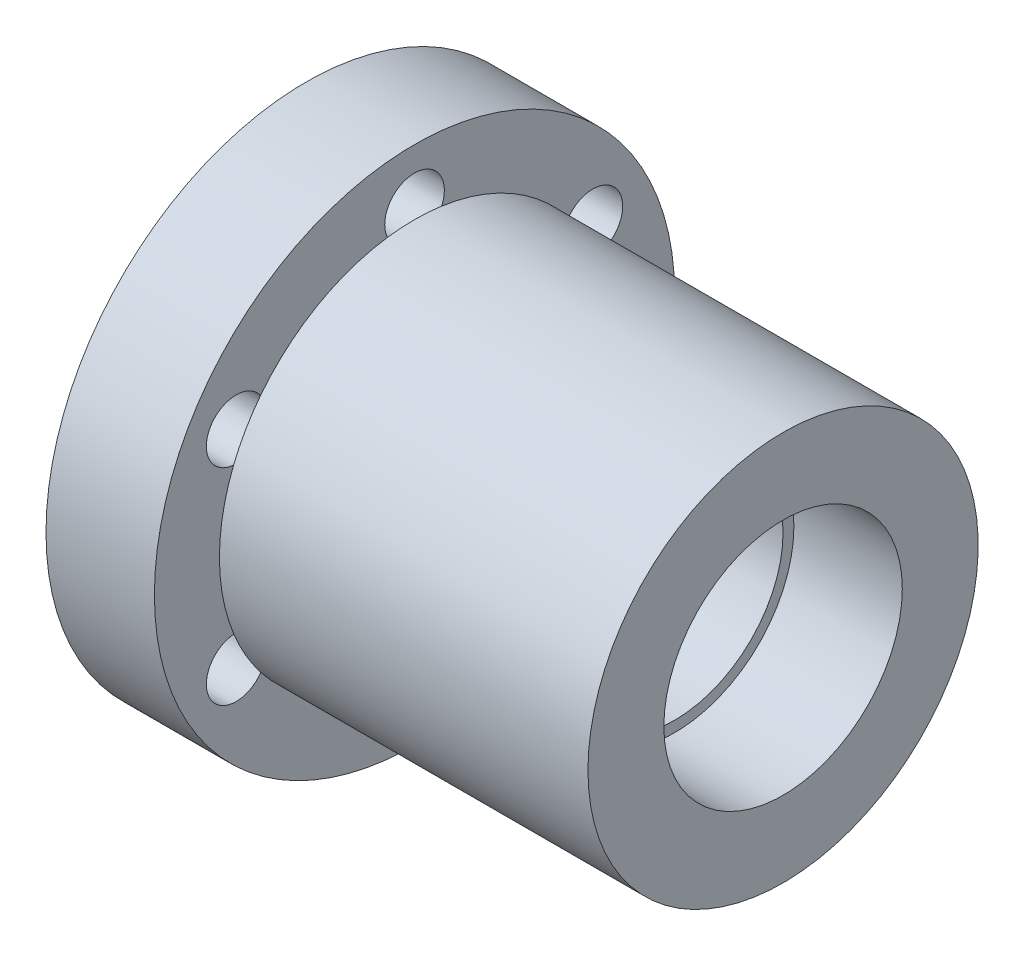
ISO-10303-21;
HEADER;
FILE_DESCRIPTION(('STEP AP214'),'2;1');
FILE_NAME('part.step','',(''),(''),'','','');
FILE_SCHEMA(('AUTOMOTIVE_DESIGN { 1 0 10303 214 1 1 1 1 }'));
ENDSEC;
DATA;
#1=APPLICATION_CONTEXT('core data for automotive mechanical design processes');
#2=APPLICATION_PROTOCOL_DEFINITION('international standard','automotive_design',2000,#1);
#3=PRODUCT_CONTEXT('',#1,'mechanical');
#4=PRODUCT('Part','Part','',(#3));
#5=PRODUCT_RELATED_PRODUCT_CATEGORY('part','',(#4));
#6=PRODUCT_DEFINITION_FORMATION('','',#4);
#7=PRODUCT_DEFINITION_CONTEXT('part definition',#1,'design');
#8=PRODUCT_DEFINITION('design','',#6,#7);
#9=PRODUCT_DEFINITION_SHAPE('','',#8);
#10=(LENGTH_UNIT() NAMED_UNIT(*) SI_UNIT(.MILLI.,.METRE.));
#11=(NAMED_UNIT(*) PLANE_ANGLE_UNIT() SI_UNIT($,.RADIAN.));
#12=(NAMED_UNIT(*) SI_UNIT($,.STERADIAN.) SOLID_ANGLE_UNIT());
#13=UNCERTAINTY_MEASURE_WITH_UNIT(LENGTH_MEASURE(1.E-05),#10,'distance_accuracy_value','');
#14=(GEOMETRIC_REPRESENTATION_CONTEXT(3) GLOBAL_UNCERTAINTY_ASSIGNED_CONTEXT((#13)) GLOBAL_UNIT_ASSIGNED_CONTEXT((#10,
#11,#12)) REPRESENTATION_CONTEXT('',''));
#15=CARTESIAN_POINT('',(0.,0.,0.));
#16=DIRECTION('',(0.,0.,1.));
#17=DIRECTION('',(1.,0.,0.));
#18=AXIS2_PLACEMENT_3D('',#15,#16,#17);
#19=CARTESIAN_POINT('',(0.,24.,0.));
#20=DIRECTION('',(-1.,0.,0.));
#21=DIRECTION('',(0.,0.,1.));
#22=AXIS2_PLACEMENT_3D('',#19,#20,#21);
#23=CYLINDRICAL_SURFACE('',#22,24.);
#24=CARTESIAN_POINT('',(9.99999999999999,24.,0.));
#25=DIRECTION('',(-1.,0.,0.));
#26=DIRECTION('',(0.,0.,1.));
#27=AXIS2_PLACEMENT_3D('',#24,#25,#26);
#28=CIRCLE('',#27,24.);
#29=CARTESIAN_POINT('',(9.99999999999999,24.,24.));
#30=VERTEX_POINT('',#29);
#31=EDGE_CURVE('E11',#30,#30,#28,.T.);
#32=ORIENTED_EDGE('',*,*,#31,.T.);
#33=EDGE_LOOP('',(#32));
#34=FACE_BOUND('',#33,.T.);
#35=CARTESIAN_POINT('',(0.,24.,0.));
#36=DIRECTION('',(-1.,0.,0.));
#37=DIRECTION('',(0.,0.,1.));
#38=AXIS2_PLACEMENT_3D('',#35,#36,#37);
#39=CIRCLE('',#38,24.);
#40=CARTESIAN_POINT('',(0.,24.,24.));
#41=VERTEX_POINT('',#40);
#42=EDGE_CURVE('E139',#41,#41,#39,.T.);
#43=ORIENTED_EDGE('',*,*,#42,.F.);
#44=EDGE_LOOP('',(#43));
#45=FACE_BOUND('',#44,.T.);
#46=ADVANCED_FACE('F37',(#34,#45),#23,.T.);
#47=CARTESIAN_POINT('',(9.99999999999999,0.,0.));
#48=DIRECTION('',(1.,0.,0.));
#49=DIRECTION('',(0.,0.,-1.));
#50=AXIS2_PLACEMENT_3D('',#47,#48,#49);
#51=PLANE('',#50);
#52=CARTESIAN_POINT('',(10.,42.9719667688482,0.));
#53=DIRECTION('',(-1.,0.,0.));
#54=DIRECTION('',(0.,0.,1.));
#55=AXIS2_PLACEMENT_3D('',#52,#53,#54);
#56=CIRCLE('',#55,2.75);
#57=CARTESIAN_POINT('',(9.99999999999999,41.8255905494437,2.49966429017656));
#58=VERTEX_POINT('',#57);
#59=CARTESIAN_POINT('',(10.,41.8255905494437,-2.49966429017656));
#60=VERTEX_POINT('',#59);
#61=EDGE_CURVE('E171',#58,#60,#56,.T.);
#62=ORIENTED_EDGE('',*,*,#61,.T.);
#63=CARTESIAN_POINT('',(9.99999999999999,24.,0.));
#64=DIRECTION('',(-1.,0.,0.));
#65=DIRECTION('',(0.,0.,1.));
#66=AXIS2_PLACEMENT_3D('',#63,#64,#65);
#67=CIRCLE('',#66,18.);
#68=CARTESIAN_POINT('',(9.99999999999999,35.0545675738859,-14.2055107530279));
#69=VERTEX_POINT('',#68);
#70=EDGE_CURVE('E116',#60,#69,#67,.T.);
#71=ORIENTED_EDGE('',*,*,#70,.T.);
#72=CARTESIAN_POINT('',(10.,33.4719667688477,-16.4544826719038));
#73=DIRECTION('',(-1.,0.,0.));
#74=DIRECTION('',(0.,0.,1.));
#75=AXIS2_PLACEMENT_3D('',#72,#73,#74);
#76=CIRCLE('',#75,2.75);
#77=CARTESIAN_POINT('',(10.,30.7323791654478,-16.6935637529152));
#78=VERTEX_POINT('',#77);
#79=EDGE_CURVE('E147',#69,#78,#76,.T.);
#80=ORIENTED_EDGE('',*,*,#79,.T.);
#81=CARTESIAN_POINT('',(9.99999999999999,17.2133834491785,-16.6715876806055));
#82=VERTEX_POINT('',#81);
#83=EDGE_CURVE('E180',#78,#82,#67,.T.);
#84=ORIENTED_EDGE('',*,*,#83,.T.);
#85=CARTESIAN_POINT('',(10.,14.4719667688476,-16.4544826719032));
#86=DIRECTION('',(-1.,0.,0.));
#87=DIRECTION('',(0.,0.,1.));
#88=AXIS2_PLACEMENT_3D('',#85,#86,#87);
#89=CIRCLE('',#88,2.75);
#90=CARTESIAN_POINT('',(10.,12.9190305378434,-14.184925652916));
#91=VERTEX_POINT('',#90);
#92=EDGE_CURVE('E148',#82,#91,#89,.T.);
#93=ORIENTED_EDGE('',*,*,#92,.T.);
#94=CARTESIAN_POINT('',(9.99999999999999,6.17094903074348,-2.47486192254298));
#95=VERTEX_POINT('',#94);
#96=EDGE_CURVE('E186',#91,#95,#67,.T.);
#97=ORIENTED_EDGE('',*,*,#96,.T.);
#98=CARTESIAN_POINT('',(10.,4.97196676884817,1.47727936570424E-12));
#99=DIRECTION('',(-1.,0.,0.));
#100=DIRECTION('',(0.,0.,1.));
#101=AXIS2_PLACEMENT_3D('',#98,#99,#100);
#102=CIRCLE('',#101,2.75);
#103=CARTESIAN_POINT('',(10.,6.17094903074386,2.47486192254574));
#104=VERTEX_POINT('',#103);
#105=EDGE_CURVE('E154',#95,#104,#102,.T.);
#106=ORIENTED_EDGE('',*,*,#105,.T.);
#107=CARTESIAN_POINT('',(9.99999999999999,12.9190305378455,14.1849256529176));
#108=VERTEX_POINT('',#107);
#109=EDGE_CURVE('E195',#104,#108,#67,.T.);
#110=ORIENTED_EDGE('',*,*,#109,.T.);
#111=CARTESIAN_POINT('',(10.,14.4719667688488,16.4544826719055));
#112=DIRECTION('',(-1.,0.,0.));
#113=DIRECTION('',(0.,0.,1.));
#114=AXIS2_PLACEMENT_3D('',#111,#112,#113);
#115=CIRCLE('',#114,2.75);
#116=CARTESIAN_POINT('',(10.,17.2133834491798,16.671587680606));
#117=VERTEX_POINT('',#116);
#118=EDGE_CURVE('E159',#108,#117,#115,.T.);
#119=ORIENTED_EDGE('',*,*,#118,.T.);
#120=CARTESIAN_POINT('',(9.99999999999999,30.7323791654488,16.6935637529148));
#121=VERTEX_POINT('',#120);
#122=EDGE_CURVE('E96',#117,#121,#67,.T.);
#123=ORIENTED_EDGE('',*,*,#122,.T.);
#124=CARTESIAN_POINT('',(10.,33.4719667688488,16.4544826719048));
#125=DIRECTION('',(-1.,0.,0.));
#126=DIRECTION('',(0.,0.,1.));
#127=AXIS2_PLACEMENT_3D('',#124,#125,#126);
#128=CIRCLE('',#127,2.75);
#129=CARTESIAN_POINT('',(10.,35.0545675738858,14.205510753028));
#130=VERTEX_POINT('',#129);
#131=EDGE_CURVE('E101',#121,#130,#128,.T.);
#132=ORIENTED_EDGE('',*,*,#131,.T.);
#133=EDGE_CURVE('E95',#130,#58,#67,.T.);
#134=ORIENTED_EDGE('',*,*,#133,.T.);
#135=EDGE_LOOP('',(#62,#71,#80,#84,#93,#97,#106,#110,#119,#123,#132,#134));
#136=FACE_BOUND('',#135,.T.);
#137=ORIENTED_EDGE('',*,*,#31,.F.);
#138=EDGE_LOOP('',(#137));
#139=FACE_BOUND('',#138,.T.);
#140=ADVANCED_FACE('F108',(#136,#139),#51,.T.);
#141=CARTESIAN_POINT('',(0.,24.,0.));
#142=DIRECTION('',(-1.,0.,0.));
#143=DIRECTION('',(0.,0.,1.));
#144=AXIS2_PLACEMENT_3D('',#141,#142,#143);
#145=CYLINDRICAL_SURFACE('',#144,18.);
#146=CARTESIAN_POINT('',(44.,24.,0.));
#147=DIRECTION('',(-1.,0.,0.));
#148=DIRECTION('',(0.,0.,1.));
#149=AXIS2_PLACEMENT_3D('',#146,#147,#148);
#150=CIRCLE('',#149,18.);
#151=CARTESIAN_POINT('',(44.,24.,18.));
#152=VERTEX_POINT('',#151);
#153=EDGE_CURVE('E118',#152,#152,#150,.T.);
#154=ORIENTED_EDGE('',*,*,#153,.T.);
#155=EDGE_LOOP('',(#154));
#156=FACE_BOUND('',#155,.T.);
#157=EDGE_CURVE('E44',#121,#130,#67,.T.);
#158=ORIENTED_EDGE('',*,*,#157,.F.);
#159=ORIENTED_EDGE('',*,*,#122,.F.);
#160=EDGE_CURVE('E198',#108,#117,#67,.T.);
#161=ORIENTED_EDGE('',*,*,#160,.F.);
#162=ORIENTED_EDGE('',*,*,#109,.F.);
#163=EDGE_CURVE('E192',#95,#104,#67,.T.);
#164=ORIENTED_EDGE('',*,*,#163,.F.);
#165=ORIENTED_EDGE('',*,*,#96,.F.);
#166=EDGE_CURVE('E185',#82,#91,#67,.T.);
#167=ORIENTED_EDGE('',*,*,#166,.F.);
#168=ORIENTED_EDGE('',*,*,#83,.F.);
#169=EDGE_CURVE('E179',#69,#78,#67,.T.);
#170=ORIENTED_EDGE('',*,*,#169,.F.);
#171=ORIENTED_EDGE('',*,*,#70,.F.);
#172=EDGE_CURVE('E115',#58,#60,#67,.T.);
#173=ORIENTED_EDGE('',*,*,#172,.F.);
#174=ORIENTED_EDGE('',*,*,#133,.F.);
#175=EDGE_LOOP('',(#158,#159,#161,#162,#164,#165,#167,#168,#170,#171,#173,#174));
#176=FACE_BOUND('',#175,.T.);
#177=ADVANCED_FACE('F113',(#156,#176),#145,.T.);
#178=CARTESIAN_POINT('',(44.,6.,0.));
#179=DIRECTION('',(1.,0.,0.));
#180=DIRECTION('',(0.,0.,-1.));
#181=AXIS2_PLACEMENT_3D('',#178,#179,#180);
#182=PLANE('',#181);
#183=CARTESIAN_POINT('',(44.,24.,0.));
#184=DIRECTION('',(-1.,0.,0.));
#185=DIRECTION('',(0.,0.,1.));
#186=AXIS2_PLACEMENT_3D('',#183,#184,#185);
#187=CIRCLE('',#186,11.);
#188=CARTESIAN_POINT('',(44.,24.,11.));
#189=VERTEX_POINT('',#188);
#190=EDGE_CURVE('E121',#189,#189,#187,.T.);
#191=ORIENTED_EDGE('',*,*,#190,.T.);
#192=EDGE_LOOP('',(#191));
#193=FACE_BOUND('',#192,.T.);
#194=ORIENTED_EDGE('',*,*,#153,.F.);
#195=EDGE_LOOP('',(#194));
#196=FACE_BOUND('',#195,.T.);
#197=ADVANCED_FACE('F247',(#193,#196),#182,.T.);
#198=CARTESIAN_POINT('',(0.,24.,0.));
#199=DIRECTION('',(-1.,0.,0.));
#200=DIRECTION('',(0.,0.,1.));
#201=AXIS2_PLACEMENT_3D('',#198,#199,#200);
#202=CYLINDRICAL_SURFACE('',#201,11.);
#203=CARTESIAN_POINT('',(34.,24.,0.));
#204=DIRECTION('',(-1.,0.,0.));
#205=DIRECTION('',(0.,0.,1.));
#206=AXIS2_PLACEMENT_3D('',#203,#204,#205);
#207=CIRCLE('',#206,11.);
#208=CARTESIAN_POINT('',(34.,24.,11.));
#209=VERTEX_POINT('',#208);
#210=EDGE_CURVE('E124',#209,#209,#207,.T.);
#211=ORIENTED_EDGE('',*,*,#210,.T.);
#212=EDGE_LOOP('',(#211));
#213=FACE_BOUND('',#212,.T.);
#214=ORIENTED_EDGE('',*,*,#190,.F.);
#215=EDGE_LOOP('',(#214));
#216=FACE_BOUND('',#215,.T.);
#217=ADVANCED_FACE('F241',(#213,#216),#202,.F.);
#218=CARTESIAN_POINT('',(34.,13.,0.));
#219=DIRECTION('',(1.,0.,0.));
#220=DIRECTION('',(0.,0.,-1.));
#221=AXIS2_PLACEMENT_3D('',#218,#219,#220);
#222=PLANE('',#221);
#223=CARTESIAN_POINT('',(34.,24.,0.));
#224=DIRECTION('',(-1.,0.,0.));
#225=DIRECTION('',(0.,0.,1.));
#226=AXIS2_PLACEMENT_3D('',#223,#224,#225);
#227=CIRCLE('',#226,10.);
#228=CARTESIAN_POINT('',(34.,24.,10.));
#229=VERTEX_POINT('',#228);
#230=EDGE_CURVE('E127',#229,#229,#227,.T.);
#231=ORIENTED_EDGE('',*,*,#230,.T.);
#232=EDGE_LOOP('',(#231));
#233=FACE_BOUND('',#232,.T.);
#234=ORIENTED_EDGE('',*,*,#210,.F.);
#235=EDGE_LOOP('',(#234));
#236=FACE_BOUND('',#235,.T.);
#237=ADVANCED_FACE('F235',(#233,#236),#222,.T.);
#238=CARTESIAN_POINT('',(0.,24.,0.));
#239=DIRECTION('',(-1.,0.,0.));
#240=DIRECTION('',(0.,0.,1.));
#241=AXIS2_PLACEMENT_3D('',#238,#239,#240);
#242=CYLINDRICAL_SURFACE('',#241,10.);
#243=CARTESIAN_POINT('',(10.,24.,0.));
#244=DIRECTION('',(-1.,0.,0.));
#245=DIRECTION('',(0.,0.,1.));
#246=AXIS2_PLACEMENT_3D('',#243,#244,#245);
#247=CIRCLE('',#246,10.);
#248=CARTESIAN_POINT('',(10.,24.,10.));
#249=VERTEX_POINT('',#248);
#250=EDGE_CURVE('E130',#249,#249,#247,.T.);
#251=ORIENTED_EDGE('',*,*,#250,.T.);
#252=EDGE_LOOP('',(#251));
#253=FACE_BOUND('',#252,.T.);
#254=ORIENTED_EDGE('',*,*,#230,.F.);
#255=EDGE_LOOP('',(#254));
#256=FACE_BOUND('',#255,.T.);
#257=ADVANCED_FACE('F229',(#253,#256),#242,.F.);
#258=CARTESIAN_POINT('',(10.,14.,0.));
#259=DIRECTION('',(-1.,0.,0.));
#260=DIRECTION('',(0.,0.,1.));
#261=AXIS2_PLACEMENT_3D('',#258,#259,#260);
#262=PLANE('',#261);
#263=CARTESIAN_POINT('',(10.,24.,0.));
#264=DIRECTION('',(-1.,0.,0.));
#265=DIRECTION('',(0.,0.,1.));
#266=AXIS2_PLACEMENT_3D('',#263,#264,#265);
#267=CIRCLE('',#266,11.);
#268=CARTESIAN_POINT('',(10.,24.,11.));
#269=VERTEX_POINT('',#268);
#270=EDGE_CURVE('E133',#269,#269,#267,.T.);
#271=ORIENTED_EDGE('',*,*,#270,.T.);
#272=EDGE_LOOP('',(#271));
#273=FACE_BOUND('',#272,.T.);
#274=ORIENTED_EDGE('',*,*,#250,.F.);
#275=EDGE_LOOP('',(#274));
#276=FACE_BOUND('',#275,.T.);
#277=ADVANCED_FACE('F223',(#273,#276),#262,.T.);
#278=CARTESIAN_POINT('',(0.,24.,0.));
#279=DIRECTION('',(-1.,0.,0.));
#280=DIRECTION('',(0.,0.,1.));
#281=AXIS2_PLACEMENT_3D('',#278,#279,#280);
#282=CYLINDRICAL_SURFACE('',#281,11.);
#283=CARTESIAN_POINT('',(0.,24.,0.));
#284=DIRECTION('',(-1.,0.,0.));
#285=DIRECTION('',(0.,0.,1.));
#286=AXIS2_PLACEMENT_3D('',#283,#284,#285);
#287=CIRCLE('',#286,11.);
#288=CARTESIAN_POINT('',(0.,24.,11.));
#289=VERTEX_POINT('',#288);
#290=EDGE_CURVE('E136',#289,#289,#287,.T.);
#291=ORIENTED_EDGE('',*,*,#290,.T.);
#292=EDGE_LOOP('',(#291));
#293=FACE_BOUND('',#292,.T.);
#294=ORIENTED_EDGE('',*,*,#270,.F.);
#295=EDGE_LOOP('',(#294));
#296=FACE_BOUND('',#295,.T.);
#297=ADVANCED_FACE('F212',(#293,#296),#282,.F.);
#298=CARTESIAN_POINT('',(0.,13.,0.));
#299=DIRECTION('',(-1.,0.,0.));
#300=DIRECTION('',(0.,0.,1.));
#301=AXIS2_PLACEMENT_3D('',#298,#299,#300);
#302=PLANE('',#301);
#303=CARTESIAN_POINT('',(0.,42.9719667688482,0.));
#304=DIRECTION('',(-1.,0.,0.));
#305=DIRECTION('',(0.,0.,1.));
#306=AXIS2_PLACEMENT_3D('',#303,#304,#305);
#307=CIRCLE('',#306,2.75);
#308=CARTESIAN_POINT('',(0.,42.9719667688482,2.75));
#309=VERTEX_POINT('',#308);
#310=EDGE_CURVE('E103',#309,#309,#307,.T.);
#311=ORIENTED_EDGE('',*,*,#310,.F.);
#312=EDGE_LOOP('',(#311));
#313=FACE_BOUND('',#312,.T.);
#314=CARTESIAN_POINT('',(0.,33.4719667688477,-16.4544826719038));
#315=DIRECTION('',(-1.,0.,0.));
#316=DIRECTION('',(0.,0.,1.));
#317=AXIS2_PLACEMENT_3D('',#314,#315,#316);
#318=CIRCLE('',#317,2.75);
#319=CARTESIAN_POINT('',(0.,33.4719667688477,-13.7044826719038));
#320=VERTEX_POINT('',#319);
#321=EDGE_CURVE('E163',#320,#320,#318,.T.);
#322=ORIENTED_EDGE('',*,*,#321,.F.);
#323=EDGE_LOOP('',(#322));
#324=FACE_BOUND('',#323,.T.);
#325=CARTESIAN_POINT('',(0.,14.4719667688476,-16.4544826719032));
#326=DIRECTION('',(-1.,0.,0.));
#327=DIRECTION('',(0.,0.,1.));
#328=AXIS2_PLACEMENT_3D('',#325,#326,#327);
#329=CIRCLE('',#328,2.75);
#330=CARTESIAN_POINT('',(0.,14.4719667688476,-13.7044826719032));
#331=VERTEX_POINT('',#330);
#332=EDGE_CURVE('E143',#331,#331,#329,.T.);
#333=ORIENTED_EDGE('',*,*,#332,.F.);
#334=EDGE_LOOP('',(#333));
#335=FACE_BOUND('',#334,.T.);
#336=CARTESIAN_POINT('',(0.,4.97196676884817,1.47727936570424E-12));
#337=DIRECTION('',(-1.,0.,0.));
#338=DIRECTION('',(0.,0.,1.));
#339=AXIS2_PLACEMENT_3D('',#336,#337,#338);
#340=CIRCLE('',#339,2.75);
#341=CARTESIAN_POINT('',(0.,4.97196676884817,2.75000000000148));
#342=VERTEX_POINT('',#341);
#343=EDGE_CURVE('E151',#342,#342,#340,.T.);
#344=ORIENTED_EDGE('',*,*,#343,.F.);
#345=EDGE_LOOP('',(#344));
#346=FACE_BOUND('',#345,.T.);
#347=CARTESIAN_POINT('',(0.,14.4719667688488,16.4544826719055));
#348=DIRECTION('',(-1.,0.,0.));
#349=DIRECTION('',(0.,0.,1.));
#350=AXIS2_PLACEMENT_3D('',#347,#348,#349);
#351=CIRCLE('',#350,2.75);
#352=CARTESIAN_POINT('',(0.,14.4719667688488,19.2044826719055));
#353=VERTEX_POINT('',#352);
#354=EDGE_CURVE('E156',#353,#353,#351,.T.);
#355=ORIENTED_EDGE('',*,*,#354,.F.);
#356=EDGE_LOOP('',(#355));
#357=FACE_BOUND('',#356,.T.);
#358=CARTESIAN_POINT('',(0.,33.4719667688488,16.4544826719048));
#359=DIRECTION('',(-1.,0.,0.));
#360=DIRECTION('',(0.,0.,1.));
#361=AXIS2_PLACEMENT_3D('',#358,#359,#360);
#362=CIRCLE('',#361,2.75);
#363=CARTESIAN_POINT('',(0.,33.4719667688488,19.2044826719048));
#364=VERTEX_POINT('',#363);
#365=EDGE_CURVE('E111',#364,#364,#362,.T.);
#366=ORIENTED_EDGE('',*,*,#365,.F.);
#367=EDGE_LOOP('',(#366));
#368=FACE_BOUND('',#367,.T.);
#369=ORIENTED_EDGE('',*,*,#42,.T.);
#370=EDGE_LOOP('',(#369));
#371=FACE_BOUND('',#370,.T.);
#372=ORIENTED_EDGE('',*,*,#290,.F.);
#373=EDGE_LOOP('',(#372));
#374=FACE_BOUND('',#373,.T.);
#375=ADVANCED_FACE('F209',(#313,#324,#335,#346,#357,#368,#371,#374),#302,.T.);
#376=CARTESIAN_POINT('',(10.,33.4719667688488,16.4544826719048));
#377=DIRECTION('',(-1.,0.,0.));
#378=DIRECTION('',(0.,0.,1.));
#379=AXIS2_PLACEMENT_3D('',#376,#377,#378);
#380=CYLINDRICAL_SURFACE('',#379,2.75);
#381=EDGE_CURVE('E90',#130,#121,#128,.T.);
#382=ORIENTED_EDGE('',*,*,#381,.F.);
#383=ORIENTED_EDGE('',*,*,#131,.F.);
#384=EDGE_LOOP('',(#382,#383));
#385=FACE_BOUND('',#384,.T.);
#386=ORIENTED_EDGE('',*,*,#365,.T.);
#387=EDGE_LOOP('',(#386));
#388=FACE_BOUND('',#387,.T.);
#389=ADVANCED_FACE('F99',(#385,#388),#380,.F.);
#390=CARTESIAN_POINT('',(10.,33.4719667688488,16.4544826719048));
#391=DIRECTION('',(-1.,0.,0.));
#392=DIRECTION('',(0.,0.,1.));
#393=AXIS2_PLACEMENT_3D('',#390,#391,#392);
#394=PLANE('',#393);
#395=ORIENTED_EDGE('',*,*,#381,.T.);
#396=ORIENTED_EDGE('',*,*,#157,.T.);
#397=EDGE_LOOP('',(#395,#396));
#398=FACE_BOUND('',#397,.T.);
#399=ADVANCED_FACE('F89',(#398),#394,.T.);
#400=CARTESIAN_POINT('',(10.,14.4719667688488,16.4544826719055));
#401=DIRECTION('',(-1.,0.,0.));
#402=DIRECTION('',(0.,0.,1.));
#403=AXIS2_PLACEMENT_3D('',#400,#401,#402);
#404=CYLINDRICAL_SURFACE('',#403,2.75);
#405=EDGE_CURVE('E50',#117,#108,#115,.T.);
#406=ORIENTED_EDGE('',*,*,#405,.F.);
#407=ORIENTED_EDGE('',*,*,#118,.F.);
#408=EDGE_LOOP('',(#406,#407));
#409=FACE_BOUND('',#408,.T.);
#410=ORIENTED_EDGE('',*,*,#354,.T.);
#411=EDGE_LOOP('',(#410));
#412=FACE_BOUND('',#411,.T.);
#413=ADVANCED_FACE('F203',(#409,#412),#404,.F.);
#414=CARTESIAN_POINT('',(10.,14.4719667688488,16.4544826719055));
#415=DIRECTION('',(-1.,0.,0.));
#416=DIRECTION('',(0.,0.,1.));
#417=AXIS2_PLACEMENT_3D('',#414,#415,#416);
#418=PLANE('',#417);
#419=ORIENTED_EDGE('',*,*,#405,.T.);
#420=ORIENTED_EDGE('',*,*,#160,.T.);
#421=EDGE_LOOP('',(#419,#420));
#422=FACE_BOUND('',#421,.T.);
#423=ADVANCED_FACE('F201',(#422),#418,.T.);
#424=CARTESIAN_POINT('',(10.,4.97196676884817,1.47727936570424E-12));
#425=DIRECTION('',(-1.,0.,0.));
#426=DIRECTION('',(0.,0.,1.));
#427=AXIS2_PLACEMENT_3D('',#424,#425,#426);
#428=CYLINDRICAL_SURFACE('',#427,2.75);
#429=EDGE_CURVE('E57',#104,#95,#102,.T.);
#430=ORIENTED_EDGE('',*,*,#429,.F.);
#431=ORIENTED_EDGE('',*,*,#105,.F.);
#432=EDGE_LOOP('',(#430,#431));
#433=FACE_BOUND('',#432,.T.);
#434=ORIENTED_EDGE('',*,*,#343,.T.);
#435=EDGE_LOOP('',(#434));
#436=FACE_BOUND('',#435,.T.);
#437=ADVANCED_FACE('F318',(#433,#436),#428,.F.);
#438=CARTESIAN_POINT('',(10.,4.97196676884817,1.47727936570424E-12));
#439=DIRECTION('',(-1.,0.,0.));
#440=DIRECTION('',(0.,0.,1.));
#441=AXIS2_PLACEMENT_3D('',#438,#439,#440);
#442=PLANE('',#441);
#443=ORIENTED_EDGE('',*,*,#429,.T.);
#444=ORIENTED_EDGE('',*,*,#163,.T.);
#445=EDGE_LOOP('',(#443,#444));
#446=FACE_BOUND('',#445,.T.);
#447=ADVANCED_FACE('F327',(#446),#442,.T.);
#448=CARTESIAN_POINT('',(10.,14.4719667688476,-16.4544826719032));
#449=DIRECTION('',(-1.,0.,0.));
#450=DIRECTION('',(0.,0.,1.));
#451=AXIS2_PLACEMENT_3D('',#448,#449,#450);
#452=CYLINDRICAL_SURFACE('',#451,2.75);
#453=ORIENTED_EDGE('',*,*,#92,.F.);
#454=EDGE_CURVE('E146',#91,#82,#89,.T.);
#455=ORIENTED_EDGE('',*,*,#454,.F.);
#456=EDGE_LOOP('',(#453,#455));
#457=FACE_BOUND('',#456,.T.);
#458=ORIENTED_EDGE('',*,*,#332,.T.);
#459=EDGE_LOOP('',(#458));
#460=FACE_BOUND('',#459,.T.);
#461=ADVANCED_FACE('F337',(#457,#460),#452,.F.);
#462=CARTESIAN_POINT('',(10.,14.4719667688476,-16.4544826719032));
#463=DIRECTION('',(-1.,0.,0.));
#464=DIRECTION('',(0.,0.,1.));
#465=AXIS2_PLACEMENT_3D('',#462,#463,#464);
#466=PLANE('',#465);
#467=ORIENTED_EDGE('',*,*,#454,.T.);
#468=ORIENTED_EDGE('',*,*,#166,.T.);
#469=EDGE_LOOP('',(#467,#468));
#470=FACE_BOUND('',#469,.T.);
#471=ADVANCED_FACE('F346',(#470),#466,.T.);
#472=CARTESIAN_POINT('',(10.,33.4719667688477,-16.4544826719038));
#473=DIRECTION('',(-1.,0.,0.));
#474=DIRECTION('',(0.,0.,1.));
#475=AXIS2_PLACEMENT_3D('',#472,#473,#474);
#476=CYLINDRICAL_SURFACE('',#475,2.75);
#477=ORIENTED_EDGE('',*,*,#79,.F.);
#478=EDGE_CURVE('E166',#78,#69,#76,.T.);
#479=ORIENTED_EDGE('',*,*,#478,.F.);
#480=EDGE_LOOP('',(#477,#479));
#481=FACE_BOUND('',#480,.T.);
#482=ORIENTED_EDGE('',*,*,#321,.T.);
#483=EDGE_LOOP('',(#482));
#484=FACE_BOUND('',#483,.T.);
#485=ADVANCED_FACE('F356',(#481,#484),#476,.F.);
#486=CARTESIAN_POINT('',(10.,33.4719667688477,-16.4544826719038));
#487=DIRECTION('',(-1.,0.,0.));
#488=DIRECTION('',(0.,0.,1.));
#489=AXIS2_PLACEMENT_3D('',#486,#487,#488);
#490=PLANE('',#489);
#491=ORIENTED_EDGE('',*,*,#478,.T.);
#492=ORIENTED_EDGE('',*,*,#169,.T.);
#493=EDGE_LOOP('',(#491,#492));
#494=FACE_BOUND('',#493,.T.);
#495=ADVANCED_FACE('F365',(#494),#490,.T.);
#496=CARTESIAN_POINT('',(10.,42.9719667688482,0.));
#497=DIRECTION('',(-1.,0.,0.));
#498=DIRECTION('',(0.,0.,1.));
#499=AXIS2_PLACEMENT_3D('',#496,#497,#498);
#500=CYLINDRICAL_SURFACE('',#499,2.75);
#501=EDGE_CURVE('E142',#60,#58,#56,.T.);
#502=ORIENTED_EDGE('',*,*,#501,.F.);
#503=ORIENTED_EDGE('',*,*,#61,.F.);
#504=EDGE_LOOP('',(#502,#503));
#505=FACE_BOUND('',#504,.T.);
#506=ORIENTED_EDGE('',*,*,#310,.T.);
#507=EDGE_LOOP('',(#506));
#508=FACE_BOUND('',#507,.T.);
#509=ADVANCED_FACE('F375',(#505,#508),#500,.F.);
#510=CARTESIAN_POINT('',(10.,42.9719667688482,0.));
#511=DIRECTION('',(-1.,0.,0.));
#512=DIRECTION('',(0.,0.,1.));
#513=AXIS2_PLACEMENT_3D('',#510,#511,#512);
#514=PLANE('',#513);
#515=ORIENTED_EDGE('',*,*,#501,.T.);
#516=ORIENTED_EDGE('',*,*,#172,.T.);
#517=EDGE_LOOP('',(#515,#516));
#518=FACE_BOUND('',#517,.T.);
#519=ADVANCED_FACE('F384',(#518),#514,.T.);
#520=CLOSED_SHELL('',(#46,#140,#177,#197,#217,#237,#257,#277,#297,#375,#389,#399,#413,#423,#437,
#447,#461,#471,#485,#495,#509,#519));
#521=MANIFOLD_SOLID_BREP('B2',#520);
#522=ADVANCED_BREP_SHAPE_REPRESENTATION('',(#18,#521),#14);
#523=SHAPE_DEFINITION_REPRESENTATION(#9,#522);
ENDSEC;
END-ISO-10303-21;
